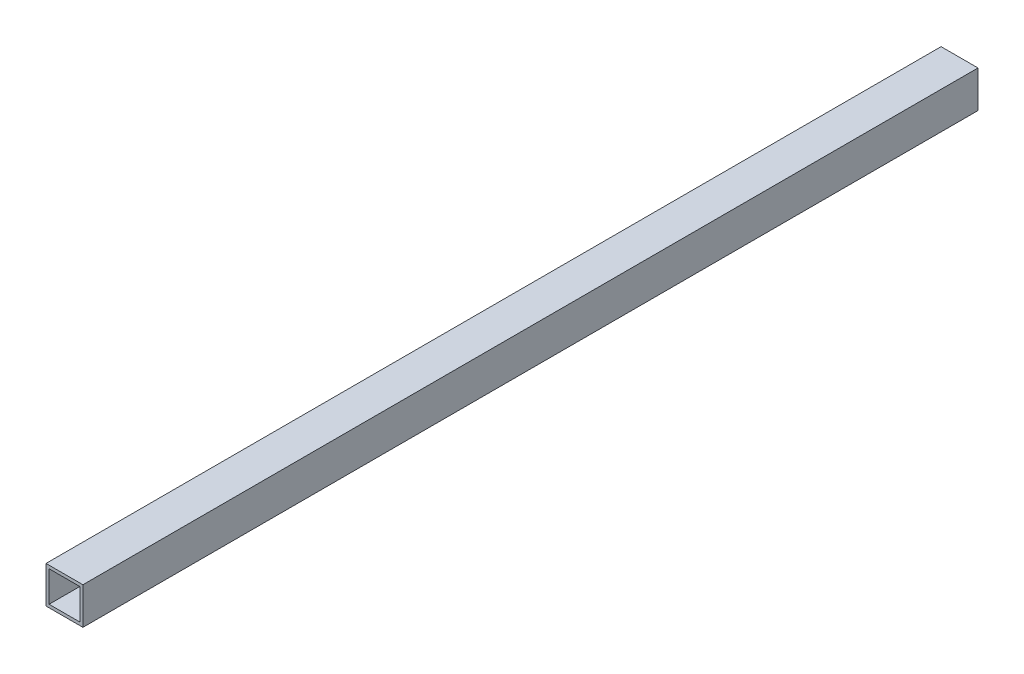
ISO-10303-21;
HEADER;
FILE_DESCRIPTION(('STEP AP214'),'2;1');
FILE_NAME('part.step','',(''),(''),'','','');
FILE_SCHEMA(('AUTOMOTIVE_DESIGN { 1 0 10303 214 1 1 1 1 }'));
ENDSEC;
DATA;
#1=APPLICATION_CONTEXT('core data for automotive mechanical design processes');
#2=APPLICATION_PROTOCOL_DEFINITION('international standard','automotive_design',2000,#1);
#3=PRODUCT_CONTEXT('',#1,'mechanical');
#4=PRODUCT('Part','Part','',(#3));
#5=PRODUCT_RELATED_PRODUCT_CATEGORY('part','',(#4));
#6=PRODUCT_DEFINITION_FORMATION('','',#4);
#7=PRODUCT_DEFINITION_CONTEXT('part definition',#1,'design');
#8=PRODUCT_DEFINITION('design','',#6,#7);
#9=PRODUCT_DEFINITION_SHAPE('','',#8);
#10=(LENGTH_UNIT() NAMED_UNIT(*) SI_UNIT(.MILLI.,.METRE.));
#11=(NAMED_UNIT(*) PLANE_ANGLE_UNIT() SI_UNIT($,.RADIAN.));
#12=(NAMED_UNIT(*) SI_UNIT($,.STERADIAN.) SOLID_ANGLE_UNIT());
#13=UNCERTAINTY_MEASURE_WITH_UNIT(LENGTH_MEASURE(1.E-05),#10,'distance_accuracy_value','');
#14=(GEOMETRIC_REPRESENTATION_CONTEXT(3) GLOBAL_UNCERTAINTY_ASSIGNED_CONTEXT((#13)) GLOBAL_UNIT_ASSIGNED_CONTEXT((#10,
#11,#12)) REPRESENTATION_CONTEXT('',''));
#15=CARTESIAN_POINT('',(0.,0.,0.));
#16=DIRECTION('',(0.,0.,1.));
#17=DIRECTION('',(1.,0.,0.));
#18=AXIS2_PLACEMENT_3D('',#15,#16,#17);
#19=CARTESIAN_POINT('',(0.,0.,830.697963948175));
#20=DIRECTION('',(0.,0.,-1.));
#21=DIRECTION('',(-1.,0.,0.));
#22=AXIS2_PLACEMENT_3D('',#19,#20,#21);
#23=PLANE('',#22);
#24=DIRECTION('',(0.,-1.,0.));
#25=VECTOR('',#24,1.);
#26=CARTESIAN_POINT('',(-263.380449824035,5.53090175855905,830.697963948175));
#27=LINE('',#26,#25);
#28=CARTESIAN_POINT('',(-263.380449824035,5.53090175855905,830.697963948175));
#29=VERTEX_POINT('',#28);
#30=CARTESIAN_POINT('',(-263.380449824035,-13.519098241441,830.697963948175));
#31=VERTEX_POINT('',#30);
#32=EDGE_CURVE('E126',#29,#31,#27,.T.);
#33=ORIENTED_EDGE('',*,*,#32,.F.);
#34=DIRECTION('',(1.,0.,0.));
#35=VECTOR('',#34,1.);
#36=CARTESIAN_POINT('',(-263.380449824035,5.53090175855905,830.697963948175));
#37=LINE('',#36,#35);
#38=CARTESIAN_POINT('',(-282.430449824035,5.53090175855905,830.697963948175));
#39=VERTEX_POINT('',#38);
#40=EDGE_CURVE('E98',#39,#29,#37,.T.);
#41=ORIENTED_EDGE('',*,*,#40,.F.);
#42=DIRECTION('',(0.,1.,0.));
#43=VECTOR('',#42,1.);
#44=CARTESIAN_POINT('',(-282.430449824035,5.53090175855905,830.697963948175));
#45=LINE('',#44,#43);
#46=CARTESIAN_POINT('',(-282.430449824035,-13.519098241441,830.697963948175));
#47=VERTEX_POINT('',#46);
#48=EDGE_CURVE('E121',#47,#39,#45,.T.);
#49=ORIENTED_EDGE('',*,*,#48,.F.);
#50=DIRECTION('',(-1.,0.,0.));
#51=VECTOR('',#50,1.);
#52=CARTESIAN_POINT('',(-263.380449824035,-13.519098241441,830.697963948175));
#53=LINE('',#52,#51);
#54=EDGE_CURVE('E117',#31,#47,#53,.T.);
#55=ORIENTED_EDGE('',*,*,#54,.F.);
#56=EDGE_LOOP('',(#33,#41,#49,#55));
#57=FACE_BOUND('',#56,.T.);
#58=DIRECTION('',(0.,-1.,0.));
#59=VECTOR('',#58,1.);
#60=CARTESIAN_POINT('',(-264.967949824035,3.94340175855905,830.697963948175));
#61=LINE('',#60,#59);
#62=CARTESIAN_POINT('',(-264.967949824035,3.94340175855905,830.697963948175));
#63=VERTEX_POINT('',#62);
#64=CARTESIAN_POINT('',(-264.967949824035,-11.931598241441,830.697963948175));
#65=VERTEX_POINT('',#64);
#66=EDGE_CURVE('E94',#63,#65,#61,.T.);
#67=ORIENTED_EDGE('',*,*,#66,.T.);
#68=DIRECTION('',(-1.,0.,0.));
#69=VECTOR('',#68,1.);
#70=CARTESIAN_POINT('',(-264.967949824035,-11.931598241441,830.697963948175));
#71=LINE('',#70,#69);
#72=CARTESIAN_POINT('',(-280.842949824035,-11.931598241441,830.697963948175));
#73=VERTEX_POINT('',#72);
#74=EDGE_CURVE('E101',#65,#73,#71,.T.);
#75=ORIENTED_EDGE('',*,*,#74,.T.);
#76=DIRECTION('',(0.,1.,0.));
#77=VECTOR('',#76,1.);
#78=CARTESIAN_POINT('',(-280.842949824035,3.94340175855905,830.697963948175));
#79=LINE('',#78,#77);
#80=CARTESIAN_POINT('',(-280.842949824035,3.94340175855905,830.697963948175));
#81=VERTEX_POINT('',#80);
#82=EDGE_CURVE('E105',#73,#81,#79,.T.);
#83=ORIENTED_EDGE('',*,*,#82,.T.);
#84=DIRECTION('',(1.,0.,0.));
#85=VECTOR('',#84,1.);
#86=CARTESIAN_POINT('',(-264.967949824035,3.94340175855905,830.697963948175));
#87=LINE('',#86,#85);
#88=EDGE_CURVE('E108',#81,#63,#87,.T.);
#89=ORIENTED_EDGE('',*,*,#88,.T.);
#90=EDGE_LOOP('',(#67,#75,#83,#89));
#91=FACE_BOUND('',#90,.T.);
#92=ADVANCED_FACE('F32',(#57,#91),#23,.F.);
#93=CARTESIAN_POINT('',(-263.380449824035,5.53090175855905,341.857195584968));
#94=DIRECTION('',(-1.,0.,0.));
#95=DIRECTION('',(0.,0.,1.));
#96=AXIS2_PLACEMENT_3D('',#93,#94,#95);
#97=PLANE('',#96);
#98=DIRECTION('',(0.,0.,1.));
#99=VECTOR('',#98,1.);
#100=CARTESIAN_POINT('',(-263.380449824035,-13.519098241441,341.857195584968));
#101=LINE('',#100,#99);
#102=CARTESIAN_POINT('',(-263.380449824035,-13.519098241441,368.797963948175));
#103=VERTEX_POINT('',#102);
#104=EDGE_CURVE('E115',#103,#31,#101,.T.);
#105=ORIENTED_EDGE('',*,*,#104,.F.);
#106=DIRECTION('',(0.,1.,0.));
#107=VECTOR('',#106,1.);
#108=CARTESIAN_POINT('',(-263.380449824035,5.53090175855905,368.797963948175));
#109=LINE('',#108,#107);
#110=CARTESIAN_POINT('',(-263.380449824035,5.53090175855905,368.797963948175));
#111=VERTEX_POINT('',#110);
#112=EDGE_CURVE('E127',#103,#111,#109,.T.);
#113=ORIENTED_EDGE('',*,*,#112,.T.);
#114=DIRECTION('',(0.,0.,1.));
#115=VECTOR('',#114,1.);
#116=CARTESIAN_POINT('',(-263.380449824035,5.53090175855905,341.857195584968));
#117=LINE('',#116,#115);
#118=EDGE_CURVE('E125',#111,#29,#117,.T.);
#119=ORIENTED_EDGE('',*,*,#118,.T.);
#120=ORIENTED_EDGE('',*,*,#32,.T.);
#121=EDGE_LOOP('',(#105,#113,#119,#120));
#122=FACE_BOUND('',#121,.T.);
#123=ADVANCED_FACE('F159',(#122),#97,.F.);
#124=CARTESIAN_POINT('',(-263.380449824035,-13.519098241441,341.857195584968));
#125=DIRECTION('',(0.,1.,0.));
#126=DIRECTION('',(0.,0.,1.));
#127=AXIS2_PLACEMENT_3D('',#124,#125,#126);
#128=PLANE('',#127);
#129=DIRECTION('',(0.,0.,1.));
#130=VECTOR('',#129,1.);
#131=CARTESIAN_POINT('',(-282.430449824035,-13.519098241441,341.857195584968));
#132=LINE('',#131,#130);
#133=CARTESIAN_POINT('',(-282.430449824035,-13.519098241441,368.797963948175));
#134=VERTEX_POINT('',#133);
#135=EDGE_CURVE('E119',#134,#47,#132,.T.);
#136=ORIENTED_EDGE('',*,*,#135,.F.);
#137=DIRECTION('',(1.,0.,0.));
#138=VECTOR('',#137,1.);
#139=CARTESIAN_POINT('',(-263.380449824035,-13.519098241441,368.797963948175));
#140=LINE('',#139,#138);
#141=EDGE_CURVE('E118',#134,#103,#140,.T.);
#142=ORIENTED_EDGE('',*,*,#141,.T.);
#143=ORIENTED_EDGE('',*,*,#104,.T.);
#144=ORIENTED_EDGE('',*,*,#54,.T.);
#145=EDGE_LOOP('',(#136,#142,#143,#144));
#146=FACE_BOUND('',#145,.T.);
#147=ADVANCED_FACE('F164',(#146),#128,.F.);
#148=CARTESIAN_POINT('',(-282.430449824035,5.53090175855905,341.857195584968));
#149=DIRECTION('',(1.,0.,0.));
#150=DIRECTION('',(0.,0.,-1.));
#151=AXIS2_PLACEMENT_3D('',#148,#149,#150);
#152=PLANE('',#151);
#153=DIRECTION('',(0.,0.,1.));
#154=VECTOR('',#153,1.);
#155=CARTESIAN_POINT('',(-282.430449824035,5.53090175855905,341.857195584968));
#156=LINE('',#155,#154);
#157=CARTESIAN_POINT('',(-282.430449824035,5.53090175855905,368.797963948175));
#158=VERTEX_POINT('',#157);
#159=EDGE_CURVE('E122',#158,#39,#156,.T.);
#160=ORIENTED_EDGE('',*,*,#159,.F.);
#161=DIRECTION('',(0.,-1.,0.));
#162=VECTOR('',#161,1.);
#163=CARTESIAN_POINT('',(-282.430449824035,5.53090175855905,368.797963948175));
#164=LINE('',#163,#162);
#165=EDGE_CURVE('E49',#158,#134,#164,.T.);
#166=ORIENTED_EDGE('',*,*,#165,.T.);
#167=ORIENTED_EDGE('',*,*,#135,.T.);
#168=ORIENTED_EDGE('',*,*,#48,.T.);
#169=EDGE_LOOP('',(#160,#166,#167,#168));
#170=FACE_BOUND('',#169,.T.);
#171=ADVANCED_FACE('F178',(#170),#152,.F.);
#172=CARTESIAN_POINT('',(-263.380449824035,5.53090175855905,341.857195584968));
#173=DIRECTION('',(0.,-1.,0.));
#174=DIRECTION('',(0.,0.,-1.));
#175=AXIS2_PLACEMENT_3D('',#172,#173,#174);
#176=PLANE('',#175);
#177=ORIENTED_EDGE('',*,*,#118,.F.);
#178=DIRECTION('',(-1.,0.,0.));
#179=VECTOR('',#178,1.);
#180=CARTESIAN_POINT('',(-263.380449824035,5.53090175855905,368.797963948175));
#181=LINE('',#180,#179);
#182=EDGE_CURVE('E124',#111,#158,#181,.T.);
#183=ORIENTED_EDGE('',*,*,#182,.T.);
#184=ORIENTED_EDGE('',*,*,#159,.T.);
#185=ORIENTED_EDGE('',*,*,#40,.T.);
#186=EDGE_LOOP('',(#177,#183,#184,#185));
#187=FACE_BOUND('',#186,.T.);
#188=ADVANCED_FACE('F180',(#187),#176,.F.);
#189=CARTESIAN_POINT('',(-264.967949824035,3.94340175855905,341.857195584968));
#190=DIRECTION('',(-1.,0.,0.));
#191=DIRECTION('',(0.,0.,1.));
#192=AXIS2_PLACEMENT_3D('',#189,#190,#191);
#193=PLANE('',#192);
#194=DIRECTION('',(0.,1.,0.));
#195=VECTOR('',#194,1.);
#196=CARTESIAN_POINT('',(-264.967949824035,3.94340175855905,368.797963948175));
#197=LINE('',#196,#195);
#198=CARTESIAN_POINT('',(-264.967949824035,-11.931598241441,368.797963948175));
#199=VERTEX_POINT('',#198);
#200=CARTESIAN_POINT('',(-264.967949824035,3.94340175855905,368.797963948175));
#201=VERTEX_POINT('',#200);
#202=EDGE_CURVE('E97',#199,#201,#197,.T.);
#203=ORIENTED_EDGE('',*,*,#202,.F.);
#204=DIRECTION('',(0.,0.,1.));
#205=VECTOR('',#204,1.);
#206=CARTESIAN_POINT('',(-264.967949824035,-11.931598241441,341.857195584968));
#207=LINE('',#206,#205);
#208=EDGE_CURVE('E90',#199,#65,#207,.T.);
#209=ORIENTED_EDGE('',*,*,#208,.T.);
#210=ORIENTED_EDGE('',*,*,#66,.F.);
#211=DIRECTION('',(0.,0.,1.));
#212=VECTOR('',#211,1.);
#213=CARTESIAN_POINT('',(-264.967949824035,3.94340175855905,341.857195584968));
#214=LINE('',#213,#212);
#215=EDGE_CURVE('E132',#201,#63,#214,.T.);
#216=ORIENTED_EDGE('',*,*,#215,.F.);
#217=EDGE_LOOP('',(#203,#209,#210,#216));
#218=FACE_BOUND('',#217,.T.);
#219=ADVANCED_FACE('F91',(#218),#193,.T.);
#220=CARTESIAN_POINT('',(-264.967949824035,-11.931598241441,341.857195584968));
#221=DIRECTION('',(0.,1.,0.));
#222=DIRECTION('',(0.,0.,1.));
#223=AXIS2_PLACEMENT_3D('',#220,#221,#222);
#224=PLANE('',#223);
#225=DIRECTION('',(1.,0.,0.));
#226=VECTOR('',#225,1.);
#227=CARTESIAN_POINT('',(-264.967949824035,-11.931598241441,368.797963948175));
#228=LINE('',#227,#226);
#229=CARTESIAN_POINT('',(-280.842949824035,-11.931598241441,368.797963948175));
#230=VERTEX_POINT('',#229);
#231=EDGE_CURVE('E11',#230,#199,#228,.T.);
#232=ORIENTED_EDGE('',*,*,#231,.F.);
#233=DIRECTION('',(0.,0.,1.));
#234=VECTOR('',#233,1.);
#235=CARTESIAN_POINT('',(-280.842949824035,-11.931598241441,341.857195584968));
#236=LINE('',#235,#234);
#237=EDGE_CURVE('E83',#230,#73,#236,.T.);
#238=ORIENTED_EDGE('',*,*,#237,.T.);
#239=ORIENTED_EDGE('',*,*,#74,.F.);
#240=ORIENTED_EDGE('',*,*,#208,.F.);
#241=EDGE_LOOP('',(#232,#238,#239,#240));
#242=FACE_BOUND('',#241,.T.);
#243=ADVANCED_FACE('F102',(#242),#224,.T.);
#244=CARTESIAN_POINT('',(-280.842949824035,3.94340175855905,341.857195584968));
#245=DIRECTION('',(1.,0.,0.));
#246=DIRECTION('',(0.,0.,-1.));
#247=AXIS2_PLACEMENT_3D('',#244,#245,#246);
#248=PLANE('',#247);
#249=DIRECTION('',(0.,-1.,0.));
#250=VECTOR('',#249,1.);
#251=CARTESIAN_POINT('',(-280.842949824035,3.94340175855905,368.797963948175));
#252=LINE('',#251,#250);
#253=CARTESIAN_POINT('',(-280.842949824035,3.94340175855905,368.797963948175));
#254=VERTEX_POINT('',#253);
#255=EDGE_CURVE('E36',#254,#230,#252,.T.);
#256=ORIENTED_EDGE('',*,*,#255,.F.);
#257=DIRECTION('',(0.,0.,1.));
#258=VECTOR('',#257,1.);
#259=CARTESIAN_POINT('',(-280.842949824035,3.94340175855905,341.857195584968));
#260=LINE('',#259,#258);
#261=EDGE_CURVE('E130',#254,#81,#260,.T.);
#262=ORIENTED_EDGE('',*,*,#261,.T.);
#263=ORIENTED_EDGE('',*,*,#82,.F.);
#264=ORIENTED_EDGE('',*,*,#237,.F.);
#265=EDGE_LOOP('',(#256,#262,#263,#264));
#266=FACE_BOUND('',#265,.T.);
#267=ADVANCED_FACE('F144',(#266),#248,.T.);
#268=CARTESIAN_POINT('',(-264.967949824035,3.94340175855905,341.857195584968));
#269=DIRECTION('',(0.,-1.,0.));
#270=DIRECTION('',(0.,0.,-1.));
#271=AXIS2_PLACEMENT_3D('',#268,#269,#270);
#272=PLANE('',#271);
#273=DIRECTION('',(-1.,0.,0.));
#274=VECTOR('',#273,1.);
#275=CARTESIAN_POINT('',(-264.967949824035,3.94340175855905,368.797963948175));
#276=LINE('',#275,#274);
#277=EDGE_CURVE('E112',#201,#254,#276,.T.);
#278=ORIENTED_EDGE('',*,*,#277,.F.);
#279=ORIENTED_EDGE('',*,*,#215,.T.);
#280=ORIENTED_EDGE('',*,*,#88,.F.);
#281=ORIENTED_EDGE('',*,*,#261,.F.);
#282=EDGE_LOOP('',(#278,#279,#280,#281));
#283=FACE_BOUND('',#282,.T.);
#284=ADVANCED_FACE('F141',(#283),#272,.T.);
#285=CARTESIAN_POINT('',(-990.321218187243,5.53090175855905,368.797963948175));
#286=DIRECTION('',(0.,0.,1.));
#287=DIRECTION('',(1.,0.,0.));
#288=AXIS2_PLACEMENT_3D('',#285,#286,#287);
#289=PLANE('',#288);
#290=ORIENTED_EDGE('',*,*,#202,.T.);
#291=ORIENTED_EDGE('',*,*,#277,.T.);
#292=ORIENTED_EDGE('',*,*,#255,.T.);
#293=ORIENTED_EDGE('',*,*,#231,.T.);
#294=EDGE_LOOP('',(#290,#291,#292,#293));
#295=FACE_BOUND('',#294,.T.);
#296=ORIENTED_EDGE('',*,*,#182,.F.);
#297=ORIENTED_EDGE('',*,*,#112,.F.);
#298=ORIENTED_EDGE('',*,*,#141,.F.);
#299=ORIENTED_EDGE('',*,*,#165,.F.);
#300=EDGE_LOOP('',(#296,#297,#298,#299));
#301=FACE_BOUND('',#300,.T.);
#302=ADVANCED_FACE('F34',(#295,#301),#289,.F.);
#303=CLOSED_SHELL('',(#92,#123,#147,#171,#188,#219,#243,#267,#284,#302));
#304=MANIFOLD_SOLID_BREP('B2',#303);
#305=ADVANCED_BREP_SHAPE_REPRESENTATION('',(#18,#304),#14);
#306=SHAPE_DEFINITION_REPRESENTATION(#9,#305);
ENDSEC;
END-ISO-10303-21;
